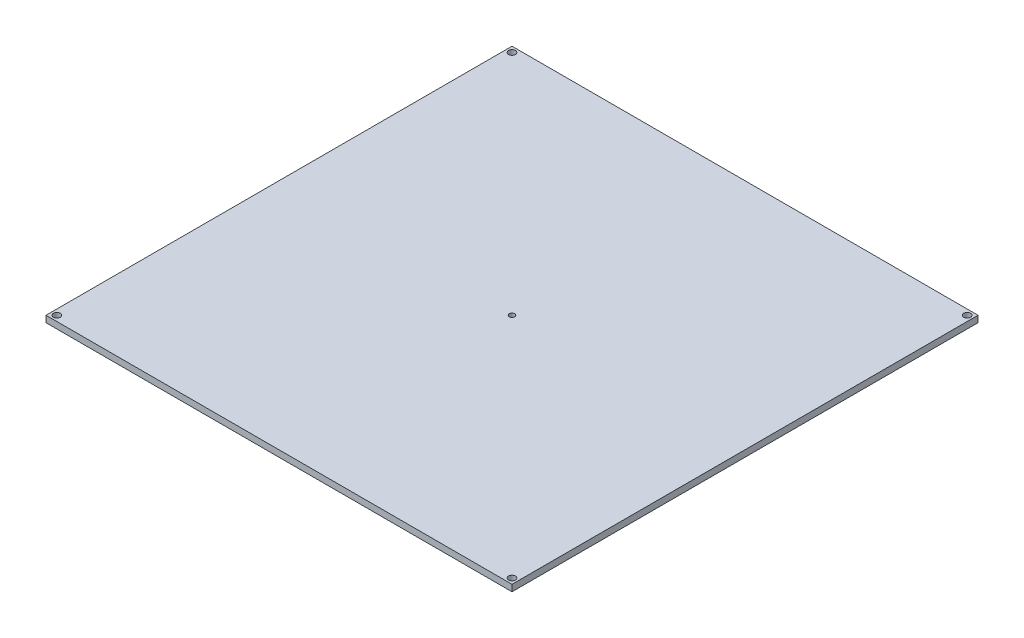
ISO-10303-21;
HEADER;
FILE_DESCRIPTION(('STEP AP214'),'2;1');
FILE_NAME('part.step','',(''),(''),'','','');
FILE_SCHEMA(('AUTOMOTIVE_DESIGN { 1 0 10303 214 1 1 1 1 }'));
ENDSEC;
DATA;
#1=APPLICATION_CONTEXT('core data for automotive mechanical design processes');
#2=APPLICATION_PROTOCOL_DEFINITION('international standard','automotive_design',2000,#1);
#3=PRODUCT_CONTEXT('',#1,'mechanical');
#4=PRODUCT('Part','Part','',(#3));
#5=PRODUCT_RELATED_PRODUCT_CATEGORY('part','',(#4));
#6=PRODUCT_DEFINITION_FORMATION('','',#4);
#7=PRODUCT_DEFINITION_CONTEXT('part definition',#1,'design');
#8=PRODUCT_DEFINITION('design','',#6,#7);
#9=PRODUCT_DEFINITION_SHAPE('','',#8);
#10=(LENGTH_UNIT() NAMED_UNIT(*) SI_UNIT(.MILLI.,.METRE.));
#11=(NAMED_UNIT(*) PLANE_ANGLE_UNIT() SI_UNIT($,.RADIAN.));
#12=(NAMED_UNIT(*) SI_UNIT($,.STERADIAN.) SOLID_ANGLE_UNIT());
#13=UNCERTAINTY_MEASURE_WITH_UNIT(LENGTH_MEASURE(1.E-05),#10,'distance_accuracy_value','');
#14=(GEOMETRIC_REPRESENTATION_CONTEXT(3) GLOBAL_UNCERTAINTY_ASSIGNED_CONTEXT((#13)) GLOBAL_UNIT_ASSIGNED_CONTEXT((#10,
#11,#12)) REPRESENTATION_CONTEXT('',''));
#15=CARTESIAN_POINT('',(0.,0.,0.));
#16=DIRECTION('',(0.,0.,1.));
#17=DIRECTION('',(1.,0.,0.));
#18=AXIS2_PLACEMENT_3D('',#15,#16,#17);
#19=CARTESIAN_POINT('',(0.,0.,0.));
#20=DIRECTION('',(0.,-1.,0.));
#21=DIRECTION('',(0.,0.,-1.));
#22=AXIS2_PLACEMENT_3D('',#19,#20,#21);
#23=PLANE('',#22);
#24=DIRECTION('',(-1.,0.,0.));
#25=VECTOR('',#24,1.);
#26=CARTESIAN_POINT('',(-107.5,0.,-107.5));
#27=LINE('',#26,#25);
#28=CARTESIAN_POINT('',(-107.5,0.,-107.5));
#29=VERTEX_POINT('',#28);
#30=CARTESIAN_POINT('',(107.5,0.,-107.5));
#31=VERTEX_POINT('',#30);
#32=EDGE_CURVE('E290',#29,#31,#27,.F.);
#33=ORIENTED_EDGE('',*,*,#32,.F.);
#34=DIRECTION('',(0.,0.,1.));
#35=VECTOR('',#34,1.);
#36=CARTESIAN_POINT('',(-107.5,0.,107.5));
#37=LINE('',#36,#35);
#38=CARTESIAN_POINT('',(-107.5,0.,107.5));
#39=VERTEX_POINT('',#38);
#40=EDGE_CURVE('E55',#39,#29,#37,.F.);
#41=ORIENTED_EDGE('',*,*,#40,.F.);
#42=DIRECTION('',(1.,0.,0.));
#43=VECTOR('',#42,1.);
#44=CARTESIAN_POINT('',(-107.5,0.,107.5));
#45=LINE('',#44,#43);
#46=CARTESIAN_POINT('',(107.5,0.,107.5));
#47=VERTEX_POINT('',#46);
#48=EDGE_CURVE('E57',#47,#39,#45,.F.);
#49=ORIENTED_EDGE('',*,*,#48,.F.);
#50=DIRECTION('',(0.,0.,-1.));
#51=VECTOR('',#50,1.);
#52=CARTESIAN_POINT('',(107.5,0.,107.5));
#53=LINE('',#52,#51);
#54=EDGE_CURVE('E60',#31,#47,#53,.F.);
#55=ORIENTED_EDGE('',*,*,#54,.F.);
#56=EDGE_LOOP('',(#33,#41,#49,#55));
#57=FACE_BOUND('',#56,.T.);
#58=CARTESIAN_POINT('',(-105.,0.,105.));
#59=DIRECTION('',(0.,1.,0.));
#60=DIRECTION('',(0.,0.,1.));
#61=AXIS2_PLACEMENT_3D('',#58,#59,#60);
#62=CIRCLE('',#61,1.6);
#63=CARTESIAN_POINT('',(-105.,0.,106.6));
#64=VERTEX_POINT('',#63);
#65=EDGE_CURVE('E75',#64,#64,#62,.F.);
#66=ORIENTED_EDGE('',*,*,#65,.T.);
#67=EDGE_LOOP('',(#66));
#68=FACE_BOUND('',#67,.T.);
#69=CARTESIAN_POINT('',(-105.,0.,-105.));
#70=DIRECTION('',(0.,1.,0.));
#71=DIRECTION('',(0.,0.,1.));
#72=AXIS2_PLACEMENT_3D('',#69,#70,#71);
#73=CIRCLE('',#72,1.6);
#74=CARTESIAN_POINT('',(-105.,0.,-103.4));
#75=VERTEX_POINT('',#74);
#76=EDGE_CURVE('E115',#75,#75,#73,.F.);
#77=ORIENTED_EDGE('',*,*,#76,.T.);
#78=EDGE_LOOP('',(#77));
#79=FACE_BOUND('',#78,.T.);
#80=CARTESIAN_POINT('',(105.,0.,105.));
#81=DIRECTION('',(0.,1.,0.));
#82=DIRECTION('',(0.,0.,1.));
#83=AXIS2_PLACEMENT_3D('',#80,#81,#82);
#84=CIRCLE('',#83,1.6);
#85=CARTESIAN_POINT('',(105.,0.,106.6));
#86=VERTEX_POINT('',#85);
#87=EDGE_CURVE('E119',#86,#86,#84,.F.);
#88=ORIENTED_EDGE('',*,*,#87,.T.);
#89=EDGE_LOOP('',(#88));
#90=FACE_BOUND('',#89,.T.);
#91=CARTESIAN_POINT('',(105.,0.,-105.));
#92=DIRECTION('',(0.,1.,0.));
#93=DIRECTION('',(0.,0.,1.));
#94=AXIS2_PLACEMENT_3D('',#91,#92,#93);
#95=CIRCLE('',#94,1.6);
#96=CARTESIAN_POINT('',(105.,0.,-103.4));
#97=VERTEX_POINT('',#96);
#98=EDGE_CURVE('E122',#97,#97,#95,.F.);
#99=ORIENTED_EDGE('',*,*,#98,.T.);
#100=EDGE_LOOP('',(#99));
#101=FACE_BOUND('',#100,.T.);
#102=CARTESIAN_POINT('',(0.,0.,0.));
#103=DIRECTION('',(0.,1.,0.));
#104=DIRECTION('',(0.,0.,1.));
#105=AXIS2_PLACEMENT_3D('',#102,#103,#104);
#106=CIRCLE('',#105,1.25);
#107=CARTESIAN_POINT('',(0.,0.,1.25));
#108=VERTEX_POINT('',#107);
#109=EDGE_CURVE('E19',#108,#108,#106,.F.);
#110=ORIENTED_EDGE('',*,*,#109,.T.);
#111=EDGE_LOOP('',(#110));
#112=FACE_BOUND('',#111,.T.);
#113=ADVANCED_FACE('F16',(#57,#68,#79,#90,#101,#112),#23,.F.);
#114=CARTESIAN_POINT('',(0.,0.,0.));
#115=DIRECTION('',(0.,1.,0.));
#116=DIRECTION('',(0.,0.,1.));
#117=AXIS2_PLACEMENT_3D('',#114,#115,#116);
#118=CYLINDRICAL_SURFACE('',#117,1.25);
#119=ORIENTED_EDGE('',*,*,#109,.F.);
#120=EDGE_LOOP('',(#119));
#121=FACE_BOUND('',#120,.T.);
#122=CARTESIAN_POINT('',(0.,-3.,0.));
#123=DIRECTION('',(0.,1.,0.));
#124=DIRECTION('',(0.,0.,1.));
#125=AXIS2_PLACEMENT_3D('',#122,#123,#124);
#126=CIRCLE('',#125,1.25);
#127=CARTESIAN_POINT('',(0.,-3.,1.25));
#128=VERTEX_POINT('',#127);
#129=EDGE_CURVE('E108',#128,#128,#126,.T.);
#130=ORIENTED_EDGE('',*,*,#129,.F.);
#131=EDGE_LOOP('',(#130));
#132=FACE_BOUND('',#131,.T.);
#133=ADVANCED_FACE('F132',(#121,#132),#118,.F.);
#134=CARTESIAN_POINT('',(105.,0.,-105.));
#135=DIRECTION('',(0.,1.,0.));
#136=DIRECTION('',(0.,0.,1.));
#137=AXIS2_PLACEMENT_3D('',#134,#135,#136);
#138=CYLINDRICAL_SURFACE('',#137,1.6);
#139=ORIENTED_EDGE('',*,*,#98,.F.);
#140=EDGE_LOOP('',(#139));
#141=FACE_BOUND('',#140,.T.);
#142=CARTESIAN_POINT('',(105.,-3.,-105.));
#143=DIRECTION('',(0.,1.,0.));
#144=DIRECTION('',(0.,0.,1.));
#145=AXIS2_PLACEMENT_3D('',#142,#143,#144);
#146=CIRCLE('',#145,1.6);
#147=CARTESIAN_POINT('',(105.,-3.,-103.4));
#148=VERTEX_POINT('',#147);
#149=EDGE_CURVE('E104',#148,#148,#146,.T.);
#150=ORIENTED_EDGE('',*,*,#149,.F.);
#151=EDGE_LOOP('',(#150));
#152=FACE_BOUND('',#151,.T.);
#153=ADVANCED_FACE('F135',(#141,#152),#138,.F.);
#154=CARTESIAN_POINT('',(105.,0.,105.));
#155=DIRECTION('',(0.,1.,0.));
#156=DIRECTION('',(0.,0.,1.));
#157=AXIS2_PLACEMENT_3D('',#154,#155,#156);
#158=CYLINDRICAL_SURFACE('',#157,1.6);
#159=ORIENTED_EDGE('',*,*,#87,.F.);
#160=EDGE_LOOP('',(#159));
#161=FACE_BOUND('',#160,.T.);
#162=CARTESIAN_POINT('',(105.,-3.,105.));
#163=DIRECTION('',(0.,1.,0.));
#164=DIRECTION('',(0.,0.,1.));
#165=AXIS2_PLACEMENT_3D('',#162,#163,#164);
#166=CIRCLE('',#165,1.6);
#167=CARTESIAN_POINT('',(105.,-3.,106.6));
#168=VERTEX_POINT('',#167);
#169=EDGE_CURVE('E100',#168,#168,#166,.T.);
#170=ORIENTED_EDGE('',*,*,#169,.F.);
#171=EDGE_LOOP('',(#170));
#172=FACE_BOUND('',#171,.T.);
#173=ADVANCED_FACE('F165',(#161,#172),#158,.F.);
#174=CARTESIAN_POINT('',(-105.,0.,-105.));
#175=DIRECTION('',(0.,1.,0.));
#176=DIRECTION('',(0.,0.,1.));
#177=AXIS2_PLACEMENT_3D('',#174,#175,#176);
#178=CYLINDRICAL_SURFACE('',#177,1.6);
#179=ORIENTED_EDGE('',*,*,#76,.F.);
#180=EDGE_LOOP('',(#179));
#181=FACE_BOUND('',#180,.T.);
#182=CARTESIAN_POINT('',(-105.,-3.,-105.));
#183=DIRECTION('',(0.,1.,0.));
#184=DIRECTION('',(0.,0.,1.));
#185=AXIS2_PLACEMENT_3D('',#182,#183,#184);
#186=CIRCLE('',#185,1.6);
#187=CARTESIAN_POINT('',(-105.,-3.,-103.4));
#188=VERTEX_POINT('',#187);
#189=EDGE_CURVE('E96',#188,#188,#186,.T.);
#190=ORIENTED_EDGE('',*,*,#189,.F.);
#191=EDGE_LOOP('',(#190));
#192=FACE_BOUND('',#191,.T.);
#193=ADVANCED_FACE('F161',(#181,#192),#178,.F.);
#194=CARTESIAN_POINT('',(-105.,0.,105.));
#195=DIRECTION('',(0.,1.,0.));
#196=DIRECTION('',(0.,0.,1.));
#197=AXIS2_PLACEMENT_3D('',#194,#195,#196);
#198=CYLINDRICAL_SURFACE('',#197,1.6);
#199=ORIENTED_EDGE('',*,*,#65,.F.);
#200=EDGE_LOOP('',(#199));
#201=FACE_BOUND('',#200,.T.);
#202=CARTESIAN_POINT('',(-105.,-3.,105.));
#203=DIRECTION('',(0.,1.,0.));
#204=DIRECTION('',(0.,0.,1.));
#205=AXIS2_PLACEMENT_3D('',#202,#203,#204);
#206=CIRCLE('',#205,1.6);
#207=CARTESIAN_POINT('',(-105.,-3.,106.6));
#208=VERTEX_POINT('',#207);
#209=EDGE_CURVE('E91',#208,#208,#206,.T.);
#210=ORIENTED_EDGE('',*,*,#209,.F.);
#211=EDGE_LOOP('',(#210));
#212=FACE_BOUND('',#211,.T.);
#213=ADVANCED_FACE('F158',(#201,#212),#198,.F.);
#214=CARTESIAN_POINT('',(107.5,-3.,107.5));
#215=DIRECTION('',(1.,0.,0.));
#216=DIRECTION('',(0.,0.,-1.));
#217=AXIS2_PLACEMENT_3D('',#214,#215,#216);
#218=PLANE('',#217);
#219=DIRECTION('',(0.,0.,-1.));
#220=VECTOR('',#219,1.);
#221=CARTESIAN_POINT('',(107.5,-3.,0.));
#222=LINE('',#221,#220);
#223=CARTESIAN_POINT('',(107.5,-3.,-107.5));
#224=VERTEX_POINT('',#223);
#225=CARTESIAN_POINT('',(107.5,-3.,107.5));
#226=VERTEX_POINT('',#225);
#227=EDGE_CURVE('E95',#224,#226,#222,.F.);
#228=ORIENTED_EDGE('',*,*,#227,.F.);
#229=DIRECTION('',(0.,1.,0.));
#230=VECTOR('',#229,1.);
#231=CARTESIAN_POINT('',(107.5,-3.,-107.5));
#232=LINE('',#231,#230);
#233=EDGE_CURVE('E72',#31,#224,#232,.F.);
#234=ORIENTED_EDGE('',*,*,#233,.F.);
#235=ORIENTED_EDGE('',*,*,#54,.T.);
#236=DIRECTION('',(0.,1.,0.));
#237=VECTOR('',#236,1.);
#238=CARTESIAN_POINT('',(107.5,-3.,107.5));
#239=LINE('',#238,#237);
#240=EDGE_CURVE('E66',#226,#47,#239,.T.);
#241=ORIENTED_EDGE('',*,*,#240,.F.);
#242=EDGE_LOOP('',(#228,#234,#235,#241));
#243=FACE_BOUND('',#242,.T.);
#244=ADVANCED_FACE('F69',(#243),#218,.T.);
#245=CARTESIAN_POINT('',(-107.5,-3.,107.5));
#246=DIRECTION('',(0.,0.,1.));
#247=DIRECTION('',(1.,0.,0.));
#248=AXIS2_PLACEMENT_3D('',#245,#246,#247);
#249=PLANE('',#248);
#250=DIRECTION('',(1.,0.,0.));
#251=VECTOR('',#250,1.);
#252=CARTESIAN_POINT('',(0.,-3.,107.5));
#253=LINE('',#252,#251);
#254=CARTESIAN_POINT('',(-107.5,-3.,107.5));
#255=VERTEX_POINT('',#254);
#256=EDGE_CURVE('E79',#226,#255,#253,.F.);
#257=ORIENTED_EDGE('',*,*,#256,.F.);
#258=ORIENTED_EDGE('',*,*,#240,.T.);
#259=ORIENTED_EDGE('',*,*,#48,.T.);
#260=DIRECTION('',(0.,1.,0.));
#261=VECTOR('',#260,1.);
#262=CARTESIAN_POINT('',(-107.5,-3.,107.5));
#263=LINE('',#262,#261);
#264=EDGE_CURVE('E87',#255,#39,#263,.T.);
#265=ORIENTED_EDGE('',*,*,#264,.F.);
#266=EDGE_LOOP('',(#257,#258,#259,#265));
#267=FACE_BOUND('',#266,.T.);
#268=ADVANCED_FACE('F77',(#267),#249,.T.);
#269=CARTESIAN_POINT('',(-107.5,-3.,107.5));
#270=DIRECTION('',(-1.,0.,0.));
#271=DIRECTION('',(0.,0.,1.));
#272=AXIS2_PLACEMENT_3D('',#269,#270,#271);
#273=PLANE('',#272);
#274=DIRECTION('',(0.,0.,-1.));
#275=VECTOR('',#274,1.);
#276=CARTESIAN_POINT('',(-107.5,-3.,0.));
#277=LINE('',#276,#275);
#278=CARTESIAN_POINT('',(-107.5,-3.,-107.5));
#279=VERTEX_POINT('',#278);
#280=EDGE_CURVE('E26',#255,#279,#277,.T.);
#281=ORIENTED_EDGE('',*,*,#280,.F.);
#282=ORIENTED_EDGE('',*,*,#264,.T.);
#283=ORIENTED_EDGE('',*,*,#40,.T.);
#284=DIRECTION('',(0.,1.,0.));
#285=VECTOR('',#284,1.);
#286=CARTESIAN_POINT('',(-107.5,-3.,-107.5));
#287=LINE('',#286,#285);
#288=EDGE_CURVE('E35',#279,#29,#287,.T.);
#289=ORIENTED_EDGE('',*,*,#288,.F.);
#290=EDGE_LOOP('',(#281,#282,#283,#289));
#291=FACE_BOUND('',#290,.T.);
#292=ADVANCED_FACE('F146',(#291),#273,.T.);
#293=CARTESIAN_POINT('',(-107.5,-3.,-107.5));
#294=DIRECTION('',(0.,0.,-1.));
#295=DIRECTION('',(-1.,0.,0.));
#296=AXIS2_PLACEMENT_3D('',#293,#294,#295);
#297=PLANE('',#296);
#298=DIRECTION('',(1.,0.,0.));
#299=VECTOR('',#298,1.);
#300=CARTESIAN_POINT('',(0.,-3.,-107.5));
#301=LINE('',#300,#299);
#302=EDGE_CURVE('E11',#279,#224,#301,.T.);
#303=ORIENTED_EDGE('',*,*,#302,.F.);
#304=ORIENTED_EDGE('',*,*,#288,.T.);
#305=ORIENTED_EDGE('',*,*,#32,.T.);
#306=ORIENTED_EDGE('',*,*,#233,.T.);
#307=EDGE_LOOP('',(#303,#304,#305,#306));
#308=FACE_BOUND('',#307,.T.);
#309=ADVANCED_FACE('F140',(#308),#297,.T.);
#310=CARTESIAN_POINT('',(0.,-3.,0.));
#311=DIRECTION('',(0.,-1.,0.));
#312=DIRECTION('',(0.,0.,-1.));
#313=AXIS2_PLACEMENT_3D('',#310,#311,#312);
#314=PLANE('',#313);
#315=ORIENTED_EDGE('',*,*,#280,.T.);
#316=ORIENTED_EDGE('',*,*,#302,.T.);
#317=ORIENTED_EDGE('',*,*,#227,.T.);
#318=ORIENTED_EDGE('',*,*,#256,.T.);
#319=EDGE_LOOP('',(#315,#316,#317,#318));
#320=FACE_BOUND('',#319,.T.);
#321=ORIENTED_EDGE('',*,*,#209,.T.);
#322=EDGE_LOOP('',(#321));
#323=FACE_BOUND('',#322,.T.);
#324=ORIENTED_EDGE('',*,*,#189,.T.);
#325=EDGE_LOOP('',(#324));
#326=FACE_BOUND('',#325,.T.);
#327=ORIENTED_EDGE('',*,*,#169,.T.);
#328=EDGE_LOOP('',(#327));
#329=FACE_BOUND('',#328,.T.);
#330=ORIENTED_EDGE('',*,*,#149,.T.);
#331=EDGE_LOOP('',(#330));
#332=FACE_BOUND('',#331,.T.);
#333=ORIENTED_EDGE('',*,*,#129,.T.);
#334=EDGE_LOOP('',(#333));
#335=FACE_BOUND('',#334,.T.);
#336=ADVANCED_FACE('F138',(#320,#323,#326,#329,#332,#335),#314,.T.);
#337=CLOSED_SHELL('',(#113,#133,#153,#173,#193,#213,#244,#268,#292,#309,#336));
#338=MANIFOLD_SOLID_BREP('B1',#337);
#339=ADVANCED_BREP_SHAPE_REPRESENTATION('',(#18,#338),#14);
#340=SHAPE_DEFINITION_REPRESENTATION(#9,#339);
ENDSEC;
END-ISO-10303-21;
